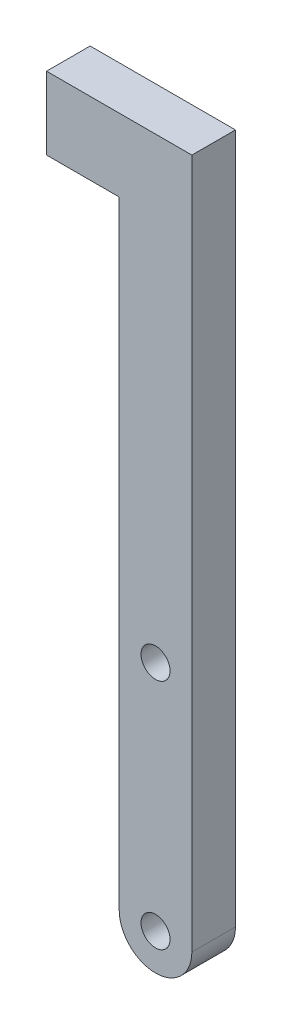
ISO-10303-21;
HEADER;
FILE_DESCRIPTION(('STEP AP214'),'2;1');
FILE_NAME('part.step','',(''),(''),'','','');
FILE_SCHEMA(('AUTOMOTIVE_DESIGN { 1 0 10303 214 1 1 1 1 }'));
ENDSEC;
DATA;
#1=APPLICATION_CONTEXT('core data for automotive mechanical design processes');
#2=APPLICATION_PROTOCOL_DEFINITION('international standard','automotive_design',2000,#1);
#3=PRODUCT_CONTEXT('',#1,'mechanical');
#4=PRODUCT('Part','Part','',(#3));
#5=PRODUCT_RELATED_PRODUCT_CATEGORY('part','',(#4));
#6=PRODUCT_DEFINITION_FORMATION('','',#4);
#7=PRODUCT_DEFINITION_CONTEXT('part definition',#1,'design');
#8=PRODUCT_DEFINITION('design','',#6,#7);
#9=PRODUCT_DEFINITION_SHAPE('','',#8);
#10=(LENGTH_UNIT() NAMED_UNIT(*) SI_UNIT(.MILLI.,.METRE.));
#11=(NAMED_UNIT(*) PLANE_ANGLE_UNIT() SI_UNIT($,.RADIAN.));
#12=(NAMED_UNIT(*) SI_UNIT($,.STERADIAN.) SOLID_ANGLE_UNIT());
#13=UNCERTAINTY_MEASURE_WITH_UNIT(LENGTH_MEASURE(1.E-05),#10,'distance_accuracy_value','');
#14=(GEOMETRIC_REPRESENTATION_CONTEXT(3) GLOBAL_UNCERTAINTY_ASSIGNED_CONTEXT((#13)) GLOBAL_UNIT_ASSIGNED_CONTEXT((#10,
#11,#12)) REPRESENTATION_CONTEXT('',''));
#15=CARTESIAN_POINT('',(0.,0.,0.));
#16=DIRECTION('',(0.,0.,1.));
#17=DIRECTION('',(1.,0.,0.));
#18=AXIS2_PLACEMENT_3D('',#15,#16,#17);
#19=CARTESIAN_POINT('',(0.,0.,3.));
#20=DIRECTION('',(1.,0.,0.));
#21=DIRECTION('',(0.,1.,0.));
#22=AXIS2_PLACEMENT_3D('',#19,#20,#21);
#23=PLANE('',#22);
#24=DIRECTION('',(0.,-1.,0.));
#25=VECTOR('',#24,1.);
#26=CARTESIAN_POINT('',(0.,0.,0.));
#27=LINE('',#26,#25);
#28=CARTESIAN_POINT('',(0.,0.,0.));
#29=VERTEX_POINT('',#28);
#30=CARTESIAN_POINT('',(0.,-5.,0.));
#31=VERTEX_POINT('',#30);
#32=EDGE_CURVE('E118',#29,#31,#27,.T.);
#33=ORIENTED_EDGE('',*,*,#32,.T.);
#34=DIRECTION('',(0.,0.,-1.));
#35=VECTOR('',#34,1.);
#36=CARTESIAN_POINT('',(0.,-5.,3.));
#37=LINE('',#36,#35);
#38=CARTESIAN_POINT('',(0.,-5.,3.));
#39=VERTEX_POINT('',#38);
#40=EDGE_CURVE('E11',#39,#31,#37,.T.);
#41=ORIENTED_EDGE('',*,*,#40,.F.);
#42=DIRECTION('',(0.,-1.,0.));
#43=VECTOR('',#42,1.);
#44=CARTESIAN_POINT('',(0.,0.,3.));
#45=LINE('',#44,#43);
#46=CARTESIAN_POINT('',(0.,0.,3.));
#47=VERTEX_POINT('',#46);
#48=EDGE_CURVE('E129',#47,#39,#45,.T.);
#49=ORIENTED_EDGE('',*,*,#48,.F.);
#50=DIRECTION('',(0.,0.,-1.));
#51=VECTOR('',#50,1.);
#52=CARTESIAN_POINT('',(0.,0.,3.));
#53=LINE('',#52,#51);
#54=EDGE_CURVE('E114',#47,#29,#53,.T.);
#55=ORIENTED_EDGE('',*,*,#54,.T.);
#56=EDGE_LOOP('',(#33,#41,#49,#55));
#57=FACE_BOUND('',#56,.T.);
#58=ADVANCED_FACE('F33',(#57),#23,.F.);
#59=CARTESIAN_POINT('',(0.,-5.,3.));
#60=DIRECTION('',(0.,1.,0.));
#61=DIRECTION('',(0.,0.,1.));
#62=AXIS2_PLACEMENT_3D('',#59,#60,#61);
#63=PLANE('',#62);
#64=DIRECTION('',(1.,0.,0.));
#65=VECTOR('',#64,1.);
#66=CARTESIAN_POINT('',(0.,-5.,0.));
#67=LINE('',#66,#65);
#68=CARTESIAN_POINT('',(5.,-5.,0.));
#69=VERTEX_POINT('',#68);
#70=EDGE_CURVE('E121',#31,#69,#67,.T.);
#71=ORIENTED_EDGE('',*,*,#70,.T.);
#72=DIRECTION('',(0.,0.,-1.));
#73=VECTOR('',#72,1.);
#74=CARTESIAN_POINT('',(5.,-5.,3.));
#75=LINE('',#74,#73);
#76=CARTESIAN_POINT('',(5.,-5.,3.));
#77=VERTEX_POINT('',#76);
#78=EDGE_CURVE('E42',#77,#69,#75,.T.);
#79=ORIENTED_EDGE('',*,*,#78,.F.);
#80=DIRECTION('',(1.,0.,0.));
#81=VECTOR('',#80,1.);
#82=CARTESIAN_POINT('',(0.,-5.,3.));
#83=LINE('',#82,#81);
#84=EDGE_CURVE('E87',#39,#77,#83,.T.);
#85=ORIENTED_EDGE('',*,*,#84,.F.);
#86=ORIENTED_EDGE('',*,*,#40,.T.);
#87=EDGE_LOOP('',(#71,#79,#85,#86));
#88=FACE_BOUND('',#87,.T.);
#89=ADVANCED_FACE('F155',(#88),#63,.F.);
#90=CARTESIAN_POINT('',(5.,-5.,3.));
#91=DIRECTION('',(1.,0.,0.));
#92=DIRECTION('',(0.,1.,0.));
#93=AXIS2_PLACEMENT_3D('',#90,#91,#92);
#94=PLANE('',#93);
#95=DIRECTION('',(0.,-1.,0.));
#96=VECTOR('',#95,1.);
#97=CARTESIAN_POINT('',(5.,-5.,0.));
#98=LINE('',#97,#96);
#99=CARTESIAN_POINT('',(5.,-47.5,0.));
#100=VERTEX_POINT('',#99);
#101=EDGE_CURVE('E124',#69,#100,#98,.T.);
#102=ORIENTED_EDGE('',*,*,#101,.T.);
#103=DIRECTION('',(0.,0.,-1.));
#104=VECTOR('',#103,1.);
#105=CARTESIAN_POINT('',(5.,-47.5,3.));
#106=LINE('',#105,#104);
#107=CARTESIAN_POINT('',(5.,-47.5,3.));
#108=VERTEX_POINT('',#107);
#109=EDGE_CURVE('E109',#108,#100,#106,.T.);
#110=ORIENTED_EDGE('',*,*,#109,.F.);
#111=DIRECTION('',(0.,-1.,0.));
#112=VECTOR('',#111,1.);
#113=CARTESIAN_POINT('',(5.,-5.,3.));
#114=LINE('',#113,#112);
#115=EDGE_CURVE('E100',#77,#108,#114,.T.);
#116=ORIENTED_EDGE('',*,*,#115,.F.);
#117=ORIENTED_EDGE('',*,*,#78,.T.);
#118=EDGE_LOOP('',(#102,#110,#116,#117));
#119=FACE_BOUND('',#118,.T.);
#120=ADVANCED_FACE('F136',(#119),#94,.F.);
#121=CARTESIAN_POINT('',(7.50000000000001,-47.5,3.));
#122=DIRECTION('',(0.,0.,-1.));
#123=DIRECTION('',(-1.,0.,0.));
#124=AXIS2_PLACEMENT_3D('',#121,#122,#123);
#125=CYLINDRICAL_SURFACE('',#124,2.50000000000001);
#126=CARTESIAN_POINT('',(7.50000000000001,-47.5,0.));
#127=DIRECTION('',(0.,0.,1.));
#128=DIRECTION('',(1.,0.,0.));
#129=AXIS2_PLACEMENT_3D('',#126,#127,#128);
#130=CIRCLE('',#129,2.50000000000001);
#131=CARTESIAN_POINT('',(10.,-47.5,0.));
#132=VERTEX_POINT('',#131);
#133=EDGE_CURVE('E108',#100,#132,#130,.T.);
#134=ORIENTED_EDGE('',*,*,#133,.T.);
#135=DIRECTION('',(0.,0.,-1.));
#136=VECTOR('',#135,1.);
#137=CARTESIAN_POINT('',(10.,-47.5,3.));
#138=LINE('',#137,#136);
#139=CARTESIAN_POINT('',(10.,-47.5,3.));
#140=VERTEX_POINT('',#139);
#141=EDGE_CURVE('E105',#140,#132,#138,.T.);
#142=ORIENTED_EDGE('',*,*,#141,.F.);
#143=CARTESIAN_POINT('',(7.50000000000001,-47.5,3.));
#144=DIRECTION('',(0.,0.,1.));
#145=DIRECTION('',(1.,0.,0.));
#146=AXIS2_PLACEMENT_3D('',#143,#144,#145);
#147=CIRCLE('',#146,2.50000000000001);
#148=EDGE_CURVE('E94',#108,#140,#147,.T.);
#149=ORIENTED_EDGE('',*,*,#148,.F.);
#150=ORIENTED_EDGE('',*,*,#109,.T.);
#151=EDGE_LOOP('',(#134,#142,#149,#150));
#152=FACE_BOUND('',#151,.T.);
#153=ADVANCED_FACE('F106',(#152),#125,.T.);
#154=CARTESIAN_POINT('',(10.,0.,3.));
#155=DIRECTION('',(-1.,0.,0.));
#156=DIRECTION('',(0.,-1.,0.));
#157=AXIS2_PLACEMENT_3D('',#154,#155,#156);
#158=PLANE('',#157);
#159=DIRECTION('',(0.,1.,0.));
#160=VECTOR('',#159,1.);
#161=CARTESIAN_POINT('',(10.,0.,0.));
#162=LINE('',#161,#160);
#163=CARTESIAN_POINT('',(10.,0.,0.));
#164=VERTEX_POINT('',#163);
#165=EDGE_CURVE('E73',#132,#164,#162,.T.);
#166=ORIENTED_EDGE('',*,*,#165,.T.);
#167=DIRECTION('',(0.,0.,-1.));
#168=VECTOR('',#167,1.);
#169=CARTESIAN_POINT('',(10.,0.,3.));
#170=LINE('',#169,#168);
#171=CARTESIAN_POINT('',(10.,0.,3.));
#172=VERTEX_POINT('',#171);
#173=EDGE_CURVE('E110',#172,#164,#170,.T.);
#174=ORIENTED_EDGE('',*,*,#173,.F.);
#175=DIRECTION('',(0.,1.,0.));
#176=VECTOR('',#175,1.);
#177=CARTESIAN_POINT('',(10.,0.,3.));
#178=LINE('',#177,#176);
#179=EDGE_CURVE('E98',#140,#172,#178,.T.);
#180=ORIENTED_EDGE('',*,*,#179,.F.);
#181=ORIENTED_EDGE('',*,*,#141,.T.);
#182=EDGE_LOOP('',(#166,#174,#180,#181));
#183=FACE_BOUND('',#182,.T.);
#184=ADVANCED_FACE('F112',(#183),#158,.F.);
#185=CARTESIAN_POINT('',(0.,0.,3.));
#186=DIRECTION('',(0.,-1.,0.));
#187=DIRECTION('',(0.,0.,-1.));
#188=AXIS2_PLACEMENT_3D('',#185,#186,#187);
#189=PLANE('',#188);
#190=DIRECTION('',(-1.,0.,0.));
#191=VECTOR('',#190,1.);
#192=CARTESIAN_POINT('',(0.,0.,0.));
#193=LINE('',#192,#191);
#194=EDGE_CURVE('E79',#164,#29,#193,.T.);
#195=ORIENTED_EDGE('',*,*,#194,.T.);
#196=ORIENTED_EDGE('',*,*,#54,.F.);
#197=DIRECTION('',(-1.,0.,0.));
#198=VECTOR('',#197,1.);
#199=CARTESIAN_POINT('',(0.,0.,3.));
#200=LINE('',#199,#198);
#201=EDGE_CURVE('E50',#172,#47,#200,.T.);
#202=ORIENTED_EDGE('',*,*,#201,.F.);
#203=ORIENTED_EDGE('',*,*,#173,.T.);
#204=EDGE_LOOP('',(#195,#196,#202,#203));
#205=FACE_BOUND('',#204,.T.);
#206=ADVANCED_FACE('F143',(#205),#189,.F.);
#207=CARTESIAN_POINT('',(7.50000000000001,-47.5,3.));
#208=DIRECTION('',(0.,0.,1.));
#209=DIRECTION('',(1.,0.,0.));
#210=AXIS2_PLACEMENT_3D('',#207,#208,#209);
#211=PLANE('',#210);
#212=CARTESIAN_POINT('',(7.50000000000001,-31.5,3.));
#213=DIRECTION('',(0.,0.,1.));
#214=DIRECTION('',(1.,0.,0.));
#215=AXIS2_PLACEMENT_3D('',#212,#213,#214);
#216=CIRCLE('',#215,1.);
#217=CARTESIAN_POINT('',(8.50000000000001,-31.5,3.));
#218=VERTEX_POINT('',#217);
#219=EDGE_CURVE('E218',#218,#218,#216,.T.);
#220=ORIENTED_EDGE('',*,*,#219,.F.);
#221=EDGE_LOOP('',(#220));
#222=FACE_BOUND('',#221,.T.);
#223=CARTESIAN_POINT('',(7.50000000000001,-47.5,3.));
#224=DIRECTION('',(0.,0.,1.));
#225=DIRECTION('',(1.,0.,0.));
#226=AXIS2_PLACEMENT_3D('',#223,#224,#225);
#227=CIRCLE('',#226,1.);
#228=CARTESIAN_POINT('',(8.50000000000001,-47.5,3.));
#229=VERTEX_POINT('',#228);
#230=EDGE_CURVE('E122',#229,#229,#227,.T.);
#231=ORIENTED_EDGE('',*,*,#230,.F.);
#232=EDGE_LOOP('',(#231));
#233=FACE_BOUND('',#232,.T.);
#234=ORIENTED_EDGE('',*,*,#48,.T.);
#235=ORIENTED_EDGE('',*,*,#84,.T.);
#236=ORIENTED_EDGE('',*,*,#115,.T.);
#237=ORIENTED_EDGE('',*,*,#148,.T.);
#238=ORIENTED_EDGE('',*,*,#179,.T.);
#239=ORIENTED_EDGE('',*,*,#201,.T.);
#240=EDGE_LOOP('',(#234,#235,#236,#237,#238,#239));
#241=FACE_BOUND('',#240,.T.);
#242=ADVANCED_FACE('F96',(#222,#233,#241),#211,.T.);
#243=CARTESIAN_POINT('',(7.50000000000001,-47.5,0.));
#244=DIRECTION('',(0.,0.,1.));
#245=DIRECTION('',(1.,0.,0.));
#246=AXIS2_PLACEMENT_3D('',#243,#244,#245);
#247=PLANE('',#246);
#248=CARTESIAN_POINT('',(7.50000000000001,-31.5,0.));
#249=DIRECTION('',(0.,0.,1.));
#250=DIRECTION('',(1.,0.,0.));
#251=AXIS2_PLACEMENT_3D('',#248,#249,#250);
#252=CIRCLE('',#251,1.);
#253=CARTESIAN_POINT('',(8.50000000000001,-31.5,0.));
#254=VERTEX_POINT('',#253);
#255=EDGE_CURVE('E36',#254,#254,#252,.T.);
#256=ORIENTED_EDGE('',*,*,#255,.T.);
#257=EDGE_LOOP('',(#256));
#258=FACE_BOUND('',#257,.T.);
#259=CARTESIAN_POINT('',(7.50000000000001,-47.5,0.));
#260=DIRECTION('',(0.,0.,-1.));
#261=DIRECTION('',(-1.,0.,0.));
#262=AXIS2_PLACEMENT_3D('',#259,#260,#261);
#263=CIRCLE('',#262,1.);
#264=CARTESIAN_POINT('',(6.50000000000001,-47.5,0.));
#265=VERTEX_POINT('',#264);
#266=EDGE_CURVE('E221',#265,#265,#263,.T.);
#267=ORIENTED_EDGE('',*,*,#266,.F.);
#268=EDGE_LOOP('',(#267));
#269=FACE_BOUND('',#268,.T.);
#270=ORIENTED_EDGE('',*,*,#32,.F.);
#271=ORIENTED_EDGE('',*,*,#194,.F.);
#272=ORIENTED_EDGE('',*,*,#165,.F.);
#273=ORIENTED_EDGE('',*,*,#133,.F.);
#274=ORIENTED_EDGE('',*,*,#101,.F.);
#275=ORIENTED_EDGE('',*,*,#70,.F.);
#276=EDGE_LOOP('',(#270,#271,#272,#273,#274,#275));
#277=FACE_BOUND('',#276,.T.);
#278=ADVANCED_FACE('F139',(#258,#269,#277),#247,.F.);
#279=CARTESIAN_POINT('',(7.50000000000001,-47.5,4.));
#280=DIRECTION('',(0.,0.,-1.));
#281=DIRECTION('',(-1.,0.,0.));
#282=AXIS2_PLACEMENT_3D('',#279,#280,#281);
#283=CYLINDRICAL_SURFACE('',#282,1.);
#284=ORIENTED_EDGE('',*,*,#230,.T.);
#285=EDGE_LOOP('',(#284));
#286=FACE_BOUND('',#285,.T.);
#287=ORIENTED_EDGE('',*,*,#266,.T.);
#288=EDGE_LOOP('',(#287));
#289=FACE_BOUND('',#288,.T.);
#290=ADVANCED_FACE('F183',(#286,#289),#283,.F.);
#291=CARTESIAN_POINT('',(7.50000000000001,-31.5,-7.));
#292=DIRECTION('',(0.,0.,1.));
#293=DIRECTION('',(1.,0.,0.));
#294=AXIS2_PLACEMENT_3D('',#291,#292,#293);
#295=CYLINDRICAL_SURFACE('',#294,1.);
#296=ORIENTED_EDGE('',*,*,#219,.T.);
#297=EDGE_LOOP('',(#296));
#298=FACE_BOUND('',#297,.T.);
#299=ORIENTED_EDGE('',*,*,#255,.F.);
#300=EDGE_LOOP('',(#299));
#301=FACE_BOUND('',#300,.T.);
#302=ADVANCED_FACE('F188',(#298,#301),#295,.F.);
#303=CLOSED_SHELL('',(#58,#89,#120,#153,#184,#206,#242,#278,#290,#302));
#304=MANIFOLD_SOLID_BREP('B2',#303);
#305=ADVANCED_BREP_SHAPE_REPRESENTATION('',(#18,#304),#14);
#306=SHAPE_DEFINITION_REPRESENTATION(#9,#305);
ENDSEC;
END-ISO-10303-21;
